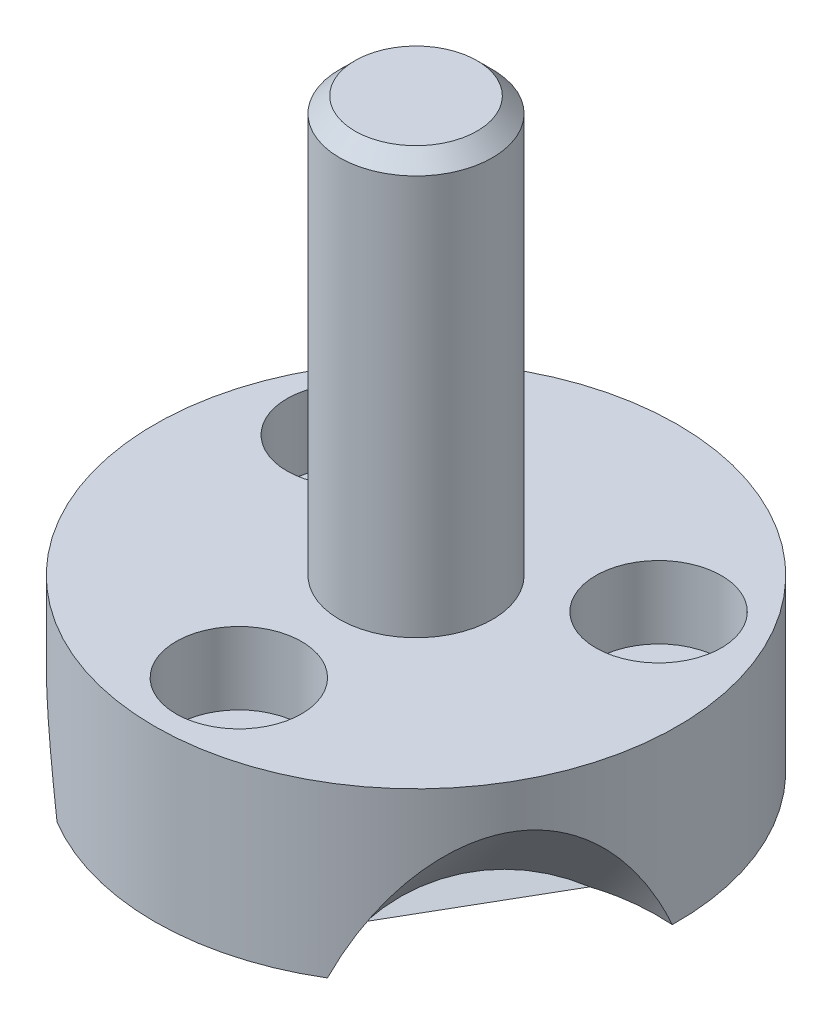
ISO-10303-21;
HEADER;
FILE_DESCRIPTION(('STEP AP214'),'2;1');
FILE_NAME('part.step','',(''),(''),'','','');
FILE_SCHEMA(('AUTOMOTIVE_DESIGN { 1 0 10303 214 1 1 1 1 }'));
ENDSEC;
DATA;
#1=APPLICATION_CONTEXT('core data for automotive mechanical design processes');
#2=APPLICATION_PROTOCOL_DEFINITION('international standard','automotive_design',2000,#1);
#3=PRODUCT_CONTEXT('',#1,'mechanical');
#4=PRODUCT('Part','Part','',(#3));
#5=PRODUCT_RELATED_PRODUCT_CATEGORY('part','',(#4));
#6=PRODUCT_DEFINITION_FORMATION('','',#4);
#7=PRODUCT_DEFINITION_CONTEXT('part definition',#1,'design');
#8=PRODUCT_DEFINITION('design','',#6,#7);
#9=PRODUCT_DEFINITION_SHAPE('','',#8);
#10=(LENGTH_UNIT() NAMED_UNIT(*) SI_UNIT(.MILLI.,.METRE.));
#11=(NAMED_UNIT(*) PLANE_ANGLE_UNIT() SI_UNIT($,.RADIAN.));
#12=(NAMED_UNIT(*) SI_UNIT($,.STERADIAN.) SOLID_ANGLE_UNIT());
#13=UNCERTAINTY_MEASURE_WITH_UNIT(LENGTH_MEASURE(1.E-05),#10,'distance_accuracy_value','');
#14=(GEOMETRIC_REPRESENTATION_CONTEXT(3) GLOBAL_UNCERTAINTY_ASSIGNED_CONTEXT((#13)) GLOBAL_UNIT_ASSIGNED_CONTEXT((#10,
#11,#12)) REPRESENTATION_CONTEXT('',''));
#15=CARTESIAN_POINT('',(0.,0.,0.));
#16=DIRECTION('',(0.,0.,1.));
#17=DIRECTION('',(1.,0.,0.));
#18=AXIS2_PLACEMENT_3D('',#15,#16,#17);
#19=CARTESIAN_POINT('',(0.,-5.5,0.));
#20=DIRECTION('',(0.,1.,0.));
#21=DIRECTION('',(0.,0.,1.));
#22=AXIS2_PLACEMENT_3D('',#19,#20,#21);
#23=CYLINDRICAL_SURFACE('',#22,8.5);
#24=CARTESIAN_POINT('',(0.,0.,0.));
#25=DIRECTION('',(0.,1.,0.));
#26=DIRECTION('',(0.,0.,1.));
#27=AXIS2_PLACEMENT_3D('',#24,#25,#26);
#28=CIRCLE('',#27,8.5);
#29=CARTESIAN_POINT('',(0.,0.,8.5));
#30=VERTEX_POINT('',#29);
#31=EDGE_CURVE('E104',#30,#30,#28,.T.);
#32=ORIENTED_EDGE('',*,*,#31,.F.);
#33=EDGE_LOOP('',(#32));
#34=FACE_BOUND('',#33,.T.);
#35=CARTESIAN_POINT('',(0.,-5.5,0.));
#36=DIRECTION('',(0.,1.,0.));
#37=DIRECTION('',(0.,0.,1.));
#38=AXIS2_PLACEMENT_3D('',#35,#36,#37);
#39=CIRCLE('',#38,8.5);
#40=CARTESIAN_POINT('',(-4.39532188587457,-5.5,7.27537940725788));
#41=VERTEX_POINT('',#40);
#42=CARTESIAN_POINT('',(4.39532188587467,-5.5,7.27537940725782));
#43=VERTEX_POINT('',#42);
#44=EDGE_CURVE('E103',#41,#43,#39,.T.);
#45=ORIENTED_EDGE('',*,*,#44,.T.);
#46=CARTESIAN_POINT('',(3.87157486946014,-7.13642907150665,7.56709376380157));
#47=CARTESIAN_POINT('',(3.91564223632895,-6.9681097408132,7.54454114760638));
#48=CARTESIAN_POINT('',(3.96249963914089,-6.80077804681708,7.52008784198153));
#49=CARTESIAN_POINT('',(4.06145164025423,-6.46830154059423,7.46711356025336));
#50=CARTESIAN_POINT('',(4.11354679466562,-6.3031569626922,7.43859215209081));
#51=CARTESIAN_POINT('',(4.2229635426209,-5.97427529652587,7.37702783136322));
#52=CARTESIAN_POINT('',(4.28031583151009,-5.81055350544804,7.34395771427627));
#53=CARTESIAN_POINT('',(4.39971674131166,-5.48587896915058,7.27305410577384));
#54=CARTESIAN_POINT('',(4.46176524198174,-5.32492615316323,7.23522073630071));
#55=CARTESIAN_POINT('',(4.59409760451867,-4.996944684743,7.15197384223668));
#56=CARTESIAN_POINT('',(4.66465021134646,-4.83010298261486,7.10624847353132));
#57=CARTESIAN_POINT('',(4.81066457433646,-4.5005524492161,7.0082267104109));
#58=CARTESIAN_POINT('',(4.88612590057415,-4.33784325773527,6.95593089108846));
#59=CARTESIAN_POINT('',(5.04169582267091,-4.01777041498957,6.84400953877659));
#60=CARTESIAN_POINT('',(5.12179228064553,-3.86039437346384,6.78440272955006));
#61=CARTESIAN_POINT('',(5.28674807347738,-3.55176294319107,6.65666447905091));
#62=CARTESIAN_POINT('',(5.37160535529237,-3.40050496380869,6.58853669698875));
#63=CARTESIAN_POINT('',(5.53394607118218,-3.12621598249609,6.45252156917746));
#64=CARTESIAN_POINT('',(5.61081220588198,-3.00218622106908,6.38592025444378));
#65=CARTESIAN_POINT('',(5.76807353882762,-2.76126537877963,6.24424044319747));
#66=CARTESIAN_POINT('',(5.84847011022187,-2.64437711860786,6.1691586300577));
#67=CARTESIAN_POINT('',(6.0116271689541,-2.42121358185558,6.01025409488309));
#68=CARTESIAN_POINT('',(6.09434763611927,-2.31482764312025,5.92654726230648));
#69=CARTESIAN_POINT('',(6.2626025587927,-2.1139985921488,5.74845945924758));
#70=CARTESIAN_POINT('',(6.34813348486487,-2.01954117167484,5.65409153929307));
#71=CARTESIAN_POINT('',(6.51937811079893,-1.84811963254262,5.45568584560505));
#72=CARTESIAN_POINT('',(6.60504665577054,-1.77081726957759,5.35190556025363));
#73=CARTESIAN_POINT('',(6.77699161126215,-1.63564576030467,5.13241853851379));
#74=CARTESIAN_POINT('',(6.86326805694279,-1.57777774764721,5.01671110690179));
#75=CARTESIAN_POINT('',(6.99159501431416,-1.50907243025117,4.83458646638067));
#76=CARTESIAN_POINT('',(7.03442578338447,-1.48912700191654,4.77207695088569));
#77=CARTESIAN_POINT('',(7.11916879807012,-1.45600651196527,4.644703838526));
#78=CARTESIAN_POINT('',(7.16108148968409,-1.44282808984782,4.57984142727889));
#79=CARTESIAN_POINT('',(7.24355179300335,-1.42365052608636,4.44825582658022));
#80=CARTESIAN_POINT('',(7.28411005080319,-1.41764791246247,4.38153355301899));
#81=CARTESIAN_POINT('',(7.36346475646622,-1.41298989370289,4.24682389569639));
#82=CARTESIAN_POINT('',(7.40226135263135,-1.41433386894887,4.17883661910858));
#83=CARTESIAN_POINT('',(7.50721543172153,-1.42829134617077,3.98885142508101));
#84=CARTESIAN_POINT('',(7.57110489715698,-1.44887896973935,3.86609755086801));
#85=CARTESIAN_POINT('',(7.69078052206784,-1.51136196051363,3.6222169176241));
#86=CARTESIAN_POINT('',(7.74656178037474,-1.55327014706342,3.50109118256495));
#87=CARTESIAN_POINT('',(7.86874874374449,-1.67367092478043,3.21934966265798));
#88=CARTESIAN_POINT('',(7.93156065501545,-1.75994152571497,3.06052249500513));
#89=CARTESIAN_POINT('',(8.04326353741963,-1.95708711608538,2.7536836226248));
#90=CARTESIAN_POINT('',(8.09212423708792,-2.06801469342191,2.60569594672328));
#91=CARTESIAN_POINT('',(8.17089781363809,-2.28690565792345,2.34554360793038));
#92=CARTESIAN_POINT('',(8.20262159274595,-2.39213912842785,2.23157762889415));
#93=CARTESIAN_POINT('',(8.25943621069332,-2.61191978592709,2.01114000399923));
#94=CARTESIAN_POINT('',(8.28452240891803,-2.72647341626476,1.90467363939893));
#95=CARTESIAN_POINT('',(8.32930184814948,-2.96349537283923,1.69822018628363));
#96=CARTESIAN_POINT('',(8.34896057595764,-3.08600849483582,1.59827751577239));
#97=CARTESIAN_POINT('',(8.38363007066104,-3.3367813127998,1.40512226971907));
#98=CARTESIAN_POINT('',(8.398641798056,-3.46503981495868,1.31190830646263));
#99=CARTESIAN_POINT('',(8.42537701279413,-3.73189150976843,1.12784709776155));
#100=CARTESIAN_POINT('',(8.43693014617856,-3.87069175274509,1.03727670548644));
#101=CARTESIAN_POINT('',(8.45658233013848,-4.15251963368135,0.862522288045537));
#102=CARTESIAN_POINT('',(8.46468056227391,-4.29554826474305,0.778339780000025));
#103=CARTESIAN_POINT('',(8.4780452408506,-4.58535287115684,0.615949418041944));
#104=CARTESIAN_POINT('',(8.48330749972258,-4.73213405459038,0.537750544785284));
#105=CARTESIAN_POINT('',(8.49150891100178,-5.02874985561887,0.38724017095559));
#106=CARTESIAN_POINT('',(8.49444794635255,-5.1785846266798,0.314928967199526));
#107=CARTESIAN_POINT('',(8.49839771934097,-5.4762278013474,0.178225102458596));
#108=CARTESIAN_POINT('',(8.49946548049044,-5.62395473678237,0.113656318736426));
#109=CARTESIAN_POINT('',(8.50021914948186,-5.92164714228945,-0.0101068724595229));
#110=CARTESIAN_POINT('',(8.49990503588927,-6.07161264704851,-0.0693011965544052));
#111=CARTESIAN_POINT('',(8.49823640742209,-6.37301039482655,-0.182070026597657));
#112=CARTESIAN_POINT('',(8.49688570374026,-6.52443526287883,-0.235664303741409));
#113=CARTESIAN_POINT('',(8.49345481098056,-6.8291067925773,-0.337335903687488));
#114=CARTESIAN_POINT('',(8.49137466840627,-6.98235333748541,-0.385413577927981));
#115=CARTESIAN_POINT('',(8.48908286700103,-7.13642907150665,-0.430664692295042));
#116=B_SPLINE_CURVE_WITH_KNOTS('',3,(#46,#47,#48,#49,#50,#51,#52,#53,#54,#55,#56,#57,#58,#59,
#60,#61,#62,#63,#64,#65,#66,#67,#68,#69,#70,#71,#72,#73,#74,#75,#76,#77,#78,#79,#80,#81,#82,#83,
#84,#85,#86,#87,#88,#89,#90,#91,#92,#93,#94,#95,#96,#97,#98,#99,#100,#101,#102,#103,#104,#105,
#106,#107,#108,#109,#110,#111,#112,#113,#114,#115),.UNSPECIFIED.,.F.,.F.,(4,2,2,2,2,2,2,2,2,2,2,
2,2,2,2,2,2,2,2,2,2,2,2,2,2,2,2,2,2,2,2,2,2,2,4),(0.,0.52630470390803,1.05266534651555,
1.58232323008113,2.11196755681693,2.67224290399541,3.23246924600453,3.79128966246386,
4.3498709201465,4.83071520074979,5.31174818954046,5.7870002618856,6.26167674328289,
6.72594203614381,7.19023440596687,7.4250215969606,7.65969207940853,7.89424897167399,
8.12878608149136,8.54630215976198,8.96406957375535,9.53487955527767,10.1069188334595,
10.5812513453392,11.0559146121617,11.5335301563574,12.0110469150276,12.5092222284578,
13.007515490422,13.5065425251256,14.0055947018824,14.4891560540191,14.972724906803,
15.4545243074039,15.9362929976529),.UNSPECIFIED.);
#117=CARTESIAN_POINT('',(8.49832433179278,-5.5,0.168770707348129));
#118=VERTEX_POINT('',#117);
#119=EDGE_CURVE('E91',#43,#118,#116,.T.);
#120=ORIENTED_EDGE('',*,*,#119,.T.);
#121=CARTESIAN_POINT('',(4.10300244591817,-5.5,-7.44415011460607));
#122=VERTEX_POINT('',#121);
#123=EDGE_CURVE('E96',#118,#122,#39,.T.);
#124=ORIENTED_EDGE('',*,*,#123,.T.);
#125=CARTESIAN_POINT('',(4.10300244591817,-5.5,-7.44415011460607));
#126=CARTESIAN_POINT('',(4.05200738124656,-5.36837939545004,-7.47225058635484));
#127=CARTESIAN_POINT('',(3.99885096925867,-5.23769581949763,-7.50087201404108));
#128=CARTESIAN_POINT('',(3.88795917211908,-4.97842335909559,-7.55894956009683));
#129=CARTESIAN_POINT('',(3.83022228553757,-4.84983517828135,-7.5884059501075));
#130=CARTESIAN_POINT('',(3.70942842946544,-4.59396369752363,-7.64818380408804));
#131=CARTESIAN_POINT('',(3.64632991259924,-4.46670118270769,-7.67851053446832));
#132=CARTESIAN_POINT('',(3.51492460300188,-4.21499725990791,-7.73954491256335));
#133=CARTESIAN_POINT('',(3.44661833250798,-4.09055557066906,-7.77025252182539));
#134=CARTESIAN_POINT('',(3.3026225115049,-3.84189383906078,-7.83255978348301));
#135=CARTESIAN_POINT('',(3.22679171223455,-3.71775607776666,-7.86416264767409));
#136=CARTESIAN_POINT('',(3.06871278474628,-3.47359206729499,-7.9271838158534));
#137=CARTESIAN_POINT('',(2.98646551640334,-3.35356527029627,-7.95860214396668));
#138=CARTESIAN_POINT('',(2.8152106932347,-3.11888996521952,-8.02077685643267));
#139=CARTESIAN_POINT('',(2.72622717782001,-3.00422449389544,-8.05153513453971));
#140=CARTESIAN_POINT('',(2.54057268772807,-2.78105841424943,-8.1120294221836));
#141=CARTESIAN_POINT('',(2.44390609063601,-2.67255435491657,-8.14176600021434));
#142=CARTESIAN_POINT('',(2.28250107599027,-2.5051943175923,-8.188048798338));
#143=CARTESIAN_POINT('',(2.22047894796706,-2.4438568700838,-8.20510842756374));
#144=CARTESIAN_POINT('',(2.09320540606682,-2.32440813328902,-8.23849602234772));
#145=CARTESIAN_POINT('',(2.0279536443655,-2.26629719292656,-8.2548239087365));
#146=CARTESIAN_POINT('',(1.82743265284243,-2.09783429025509,-8.30237166731931));
#147=CARTESIAN_POINT('',(1.6870747850213,-1.99301034158126,-8.33225056053869));
#148=CARTESIAN_POINT('',(1.39001427743714,-1.80238910383917,-8.38694571169093));
#149=CARTESIAN_POINT('',(1.23312405190653,-1.71685486498451,-8.41169164584652));
#150=CARTESIAN_POINT('',(0.987926390141024,-1.60980966570019,-8.44279508895132));
#151=CARTESIAN_POINT('',(0.904589457200721,-1.57768021842646,-8.45215749198613));
#152=CARTESIAN_POINT('',(0.735062615100133,-1.52140191443346,-8.46858543137649));
#153=CARTESIAN_POINT('',(0.648873764324658,-1.49725013284282,-8.47565180951379));
#154=CARTESIAN_POINT('',(0.427951099860851,-1.4473350373683,-8.49027121159061));
#155=CARTESIAN_POINT('',(0.291689551723714,-1.42749660558052,-8.49609874236993));
#156=CARTESIAN_POINT('',(0.0176849746978008,-1.41051535160195,-8.50108594812936));
#157=CARTESIAN_POINT('',(-0.120057524937583,-1.4133646740909,-8.50024793096311));
#158=CARTESIAN_POINT('',(-0.392743304210189,-1.44140511570736,-8.49201605382392));
#159=CARTESIAN_POINT('',(-0.527691288564347,-1.46655491634786,-8.48463431810659));
#160=CARTESIAN_POINT('',(-0.791782459923716,-1.5368043713075,-8.46408212648829));
#161=CARTESIAN_POINT('',(-0.920921290626464,-1.58191873115134,-8.45090740362603));
#162=CARTESIAN_POINT('',(-1.2264928262482,-1.71228515141529,-8.4130093836411));
#163=CARTESIAN_POINT('',(-1.39877692995277,-1.80646335462337,-8.38575531626123));
#164=CARTESIAN_POINT('',(-1.72588648253423,-2.01970653475278,-8.3246151014175));
#165=CARTESIAN_POINT('',(-1.88066516351825,-2.13883586072945,-8.29071182027117));
#166=CARTESIAN_POINT('',(-2.15090154066114,-2.37471692645606,-8.22434294734774));
#167=CARTESIAN_POINT('',(-2.2687341086961,-2.48896984335108,-8.19247042295787));
#168=CARTESIAN_POINT('',(-2.49380875424836,-2.72704745586128,-8.1267876947958));
#169=CARTESIAN_POINT('',(-2.60104267644778,-2.85087939361705,-8.09297603004637));
#170=CARTESIAN_POINT('',(-2.80632154609719,-3.10634632326903,-8.02410845425059));
#171=CARTESIAN_POINT('',(-2.90433045786907,-3.23800888271861,-7.98904834591457));
#172=CARTESIAN_POINT('',(-3.0916810506407,-3.50713945302687,-7.91842932956664));
#173=CARTESIAN_POINT('',(-3.18102520917198,-3.64460578816744,-7.88287056748415));
#174=CARTESIAN_POINT('',(-3.3499548364079,-3.92107021483571,-7.81255247020373));
#175=CARTESIAN_POINT('',(-3.42971701182835,-4.05996102199552,-7.77779348804984));
#176=CARTESIAN_POINT('',(-3.58243704550269,-4.34153769433779,-7.70864236692192));
#177=CARTESIAN_POINT('',(-3.65539391835626,-4.48422410528711,-7.67425028171073));
#178=CARTESIAN_POINT('',(-3.79409067796556,-4.77093208283211,-7.60662600360306));
#179=CARTESIAN_POINT('',(-3.85991200391708,-4.91491222760835,-7.57338454696442));
#180=CARTESIAN_POINT('',(-3.98572736651346,-5.20553762483576,-7.50792650062966));
#181=CARTESIAN_POINT('',(-4.04572435261965,-5.35218148323759,-7.47570939781554));
#182=CARTESIAN_POINT('',(-4.10300244591817,-5.5,-7.44415011460607));
#183=B_SPLINE_CURVE_WITH_KNOTS('',3,(#125,#126,#127,#128,#129,#130,#131,#132,#133,#134,#135,
#136,#137,#138,#139,#140,#141,#142,#143,#144,#145,#146,#147,#148,#149,#150,#151,#152,#153,#154,
#155,#156,#157,#158,#159,#160,#161,#162,#163,#164,#165,#166,#167,#168,#169,#170,#171,#172,#173,
#174,#175,#176,#177,#178,#179,#180,#181,#182),.UNSPECIFIED.,.F.,.F.,(4,2,2,2,2,2,2,2,2,2,2,2,2,
2,2,2,2,2,2,2,2,2,2,2,2,2,2,2,4),(0.,0.43176735396568,0.86367682603263,1.2993071972587,
1.73489394047465,2.18130009103921,2.62764652086448,3.07246905274674,3.51703993062881,
3.78357796441595,4.05014476647939,4.58184689295916,5.12041195392308,5.38945473963858,
5.65839877576043,6.06982437872431,6.48110753747512,6.89163025641231,7.30245586340119,
7.89377583898554,8.48664003540864,8.98751996153729,9.48878234622662,9.99192792795134,
10.494929217375,10.9864041693644,11.4779501762714,11.9631108808027,12.4480246028145),.UNSPECIFIED.);
#184=CARTESIAN_POINT('',(-4.10300244591817,-5.5,-7.44415011460607));
#185=VERTEX_POINT('',#184);
#186=EDGE_CURVE('E152',#122,#185,#183,.T.);
#187=ORIENTED_EDGE('',*,*,#186,.T.);
#188=CARTESIAN_POINT('',(-8.49832433179278,-5.5,0.168770707348247));
#189=VERTEX_POINT('',#188);
#190=EDGE_CURVE('E106',#185,#189,#39,.T.);
#191=ORIENTED_EDGE('',*,*,#190,.T.);
#192=CARTESIAN_POINT('',(-8.49832433179278,-5.5,0.168770707348248));
#193=CARTESIAN_POINT('',(-8.49716252184974,-5.36837939545004,0.226983964695883));
#194=CARTESIAN_POINT('',(-8.49537119932465,-5.23769581949763,0.287329481694546));
#195=CARTESIAN_POINT('',(-8.4902219310286,-4.97842335909559,0.412403368116617));
#196=CARTESIAN_POINT('',(-8.48686346979087,-4.84983517828135,0.477133173636961));
#197=CARTESIAN_POINT('',(-8.47823568188567,-4.59396369752363,0.611632648606781));
#198=CARTESIAN_POINT('',(-8.47295014237561,-4.46670118270769,0.681440932344171));
#199=CARTESIAN_POINT('',(-8.46010480951141,-4.21499725990791,0.825758457695156));
#200=CARTESIAN_POINT('',(-8.45254524397487,-4.09055557066906,0.900267227811663));
#201=CARTESIAN_POINT('',(-8.43450700490907,-3.84189383906077,1.05612489766794));
#202=CARTESIAN_POINT('',(-8.42396048849572,-3.71775607776666,1.13759772832089));
#203=CARTESIAN_POINT('',(-8.39949895737104,-3.47359206729499,1.30600867941837));
#204=CARTESIAN_POINT('',(-8.38558439349011,-3.35356527029627,1.39294606725187));
#205=CARTESIAN_POINT('',(-8.35380186237432,-3.11888996521951,1.57234445086952));
#206=CARTESIAN_POINT('',(-8.33594755488434,-3.00422449389543,1.66478557479021));
#207=CARTESIAN_POINT('',(-8.29550989972182,-2.78105841424943,1.85581422335842));
#208=CARTESIAN_POINT('',(-8.27292923317204,-2.67255435491657,1.95439824115291));
#209=CARTESIAN_POINT('',(-8.23230880478248,-2.5051943175923,2.11732048319615));
#210=CARTESIAN_POINT('',(-8.21607181305951,-2.4438568700838,2.17956303627389));
#211=CARTESIAN_POINT('',(-8.18134954736358,-2.32440813328902,2.30647895418111));
#212=CARTESIAN_POINT('',(-8.1628640309157,-2.26629719292656,2.37115258065054));
#213=CARTESIAN_POINT('',(-8.10378110197989,-2.09783429025509,2.56858273259296));
#214=CARTESIAN_POINT('',(-8.05947804863427,-1.99301034158126,2.70507565835677));
#215=CARTESIAN_POINT('',(-7.95831518520386,-1.80238910383917,2.98968517996187));
#216=CARTESIAN_POINT('',(-7.90130068005768,-1.71685486498451,3.13792906795464));
#217=CARTESIAN_POINT('',(-7.80563822104884,-1.60980966570019,3.36582819354452));
#218=CARTESIAN_POINT('',(-7.7720778334473,-1.57768021842647,3.4426812960617));
#219=CARTESIAN_POINT('',(-7.70154142524088,-1.52140191443346,3.59770981763934));
#220=CARTESIAN_POINT('',(-7.6645666628328,-1.49725013284282,3.67588474100254));
#221=CARTESIAN_POINT('',(-7.56676610418756,-1.4473350373683,3.87451908173836));
#222=CARTESIAN_POINT('',(-7.50368211981522,-1.42749660558052,3.99543880937377));
#223=CARTESIAN_POINT('',(-7.37099887818383,-1.41051535160195,4.23522733671114));
#224=CARTESIAN_POINT('',(-7.30140188421136,-1.4133646740909,4.35409683199302));
#225=CARTESIAN_POINT('',(-7.15792997985168,-1.44140511570736,4.58613370552426));
#226=CARTESIAN_POINT('',(-7.08406321701937,-1.46655491634786,4.6993112203058));
#227=CARTESIAN_POINT('',(-6.93421891129479,-1.5368043713075,4.91774478780905));
#228=CARTESIAN_POINT('',(-6.85823985125687,-1.58191873115134,5.02299493438151));
#229=CARTESIAN_POINT('',(-6.67263343538593,-1.71228515141529,5.2686786369109));
#230=CARTESIAN_POINT('',(-6.56288866882622,-1.80646335462337,5.40425401369735));
#231=CARTESIAN_POINT('',(-6.34638491328799,-2.01970653475279,5.65696908863159));
#232=CARTESIAN_POINT('',(-6.23963447005161,-2.13883586072945,5.77405971775483));
#233=CARTESIAN_POINT('',(-6.04703915150793,-2.37471692645606,5.97490684892553));
#234=CARTESIAN_POINT('',(-5.96052045168608,-2.48896984335108,6.06101658404203));
#235=CARTESIAN_POINT('',(-5.79110021773173,-2.72704745586128,6.22309558075703));
#236=CARTESIAN_POINT('',(-5.70820149601477,-2.85087939361705,6.29905704915446));
#237=CARTESIAN_POINT('',(-5.54592099105387,-3.10634632326903,6.44239997723311));
#238=CARTESIAN_POINT('',(-5.4665535906895,-3.23800888271861,6.50974813045682));
#239=CARTESIAN_POINT('',(-5.31172043215611,-3.50713945302687,6.63668899503716));
#240=CARTESIAN_POINT('',(-5.2362535615999,-3.64460578816744,6.69628392496374));
#241=CARTESIAN_POINT('',(-5.09089148939132,-3.92107021483571,6.80742222496167));
#242=CARTESIAN_POINT('',(-5.02090824012613,-4.05996102199552,6.85911880405994));
#243=CARTESIAN_POINT('',(-4.88466159569201,-4.34153769433779,6.95680267232478));
#244=CARTESIAN_POINT('',(-4.81839873978322,-4.48422410528711,7.00278913499105));
#245=CARTESIAN_POINT('',(-4.69048601722474,-4.77093208283211,7.08909191318146));
#246=CARTESIAN_POINT('',(-4.62878740834112,-4.91491222760835,7.12947412524692));
#247=CARTESIAN_POINT('',(-4.50919139603493,-5.20553762483576,7.20570440227436));
#248=CARTESIAN_POINT('',(-4.45129207350846,-5.35218148323759,7.24155476498576));
#249=CARTESIAN_POINT('',(-4.39532188587457,-5.5,7.27537940725788));
#250=B_SPLINE_CURVE_WITH_KNOTS('',3,(#192,#193,#194,#195,#196,#197,#198,#199,#200,#201,#202,
#203,#204,#205,#206,#207,#208,#209,#210,#211,#212,#213,#214,#215,#216,#217,#218,#219,#220,#221,
#222,#223,#224,#225,#226,#227,#228,#229,#230,#231,#232,#233,#234,#235,#236,#237,#238,#239,#240,
#241,#242,#243,#244,#245,#246,#247,#248,#249),.UNSPECIFIED.,.F.,.F.,(4,2,2,2,2,2,2,2,2,2,2,2,2,
2,2,2,2,2,2,2,2,2,2,2,2,2,2,2,4),(0.,0.431767353965681,0.86367682603263,1.2993071972587,
1.73489394047465,2.18130009103921,2.62764652086448,3.07246905274674,3.51703993062881,
3.78357796441595,4.05014476647939,4.58184689295917,5.12041195392308,5.38945473963858,
5.65839877576043,6.06982437872431,6.48110753747512,6.89163025641231,7.30245586340118,
7.89377583898554,8.48664003540864,8.98751996153729,9.48878234622661,9.99192792795134,
10.494929217375,10.9864041693643,11.4779501762714,11.9631108808027,12.4480246028145),.UNSPECIFIED.);
#251=EDGE_CURVE('E148',#189,#41,#250,.T.);
#252=ORIENTED_EDGE('',*,*,#251,.T.);
#253=EDGE_LOOP('',(#45,#120,#124,#187,#191,#252));
#254=FACE_BOUND('',#253,.T.);
#255=ADVANCED_FACE('F32',(#34,#254),#23,.T.);
#256=CARTESIAN_POINT('',(0.,-5.5,0.));
#257=DIRECTION('',(0.,1.,0.));
#258=DIRECTION('',(0.,0.,1.));
#259=AXIS2_PLACEMENT_3D('',#256,#257,#258);
#260=PLANE('',#259);
#261=CARTESIAN_POINT('',(0.,-5.5,0.));
#262=DIRECTION('',(0.,-1.,0.));
#263=DIRECTION('',(0.,0.,-1.));
#264=AXIS2_PLACEMENT_3D('',#261,#262,#263);
#265=CIRCLE('',#264,4.5);
#266=CARTESIAN_POINT('',(0.,-5.5,-4.5));
#267=VERTEX_POINT('',#266);
#268=EDGE_CURVE('E209',#267,#267,#265,.T.);
#269=ORIENTED_EDGE('',*,*,#268,.F.);
#270=EDGE_LOOP('',(#269));
#271=FACE_BOUND('',#270,.T.);
#272=CARTESIAN_POINT('',(4.96598786707596,-5.5,-2.91930210051211));
#273=DIRECTION('',(0.,1.,0.));
#274=DIRECTION('',(0.,0.,1.));
#275=AXIS2_PLACEMENT_3D('',#272,#273,#274);
#276=CIRCLE('',#275,1.065);
#277=CARTESIAN_POINT('',(4.96598786707596,-5.5,-1.85430210051211));
#278=VERTEX_POINT('',#277);
#279=EDGE_CURVE('E129',#278,#278,#276,.T.);
#280=ORIENTED_EDGE('',*,*,#279,.T.);
#281=EDGE_LOOP('',(#280));
#282=FACE_BOUND('',#281,.T.);
#283=CARTESIAN_POINT('',(0.,-5.5,5.7605));
#284=DIRECTION('',(0.,1.,0.));
#285=DIRECTION('',(0.,0.,1.));
#286=AXIS2_PLACEMENT_3D('',#283,#284,#285);
#287=CIRCLE('',#286,1.065);
#288=CARTESIAN_POINT('',(0.,-5.5,6.8255));
#289=VERTEX_POINT('',#288);
#290=EDGE_CURVE('E187',#289,#289,#287,.T.);
#291=ORIENTED_EDGE('',*,*,#290,.T.);
#292=EDGE_LOOP('',(#291));
#293=FACE_BOUND('',#292,.T.);
#294=CARTESIAN_POINT('',(-5.03393518532704,-5.5,-2.88007269802913));
#295=DIRECTION('',(0.,1.,0.));
#296=DIRECTION('',(0.,0.,1.));
#297=AXIS2_PLACEMENT_3D('',#294,#295,#296);
#298=CIRCLE('',#297,1.065);
#299=CARTESIAN_POINT('',(-5.03393518532704,-5.5,-1.81507269802913));
#300=VERTEX_POINT('',#299);
#301=EDGE_CURVE('E134',#300,#300,#298,.T.);
#302=ORIENTED_EDGE('',*,*,#301,.T.);
#303=EDGE_LOOP('',(#302));
#304=FACE_BOUND('',#303,.T.);
#305=CARTESIAN_POINT('',(9.9465454397029,-5.5,5.74264068711919));
#306=DIRECTION('',(0.,1.,0.));
#307=DIRECTION('',(-0.866025403784443,0.,-0.499999999999992));
#308=AXIS2_PLACEMENT_3D('',#305,#306,#307);
#309=ELLIPSE('',#308,7.07106781186548,5.);
#310=CARTESIAN_POINT('',(6.0943237272159,-5.5,0.444321666689478));
#311=VERTEX_POINT('',#310);
#312=EDGE_CURVE('E11',#311,#118,#309,.F.);
#313=ORIENTED_EDGE('',*,*,#312,.F.);
#314=DIRECTION('',(0.499999999999992,0.,-0.866025403784443));
#315=VECTOR('',#314,1.);
#316=CARTESIAN_POINT('',(4.76313972081444,-5.5,2.74999999999995));
#317=LINE('',#316,#315);
#318=CARTESIAN_POINT('',(3.43195571441297,-5.5,5.05567833331043));
#319=VERTEX_POINT('',#318);
#320=EDGE_CURVE('E82',#319,#311,#317,.T.);
#321=ORIENTED_EDGE('',*,*,#320,.F.);
#322=EDGE_CURVE('E36',#43,#319,#309,.F.);
#323=ORIENTED_EDGE('',*,*,#322,.F.);
#324=ORIENTED_EDGE('',*,*,#44,.F.);
#325=CARTESIAN_POINT('',(-9.94654543970282,-5.5,5.74264068711933));
#326=DIRECTION('',(0.,1.,0.));
#327=DIRECTION('',(0.866025403784436,0.,-0.500000000000004));
#328=AXIS2_PLACEMENT_3D('',#325,#326,#327);
#329=ELLIPSE('',#328,7.07106781186548,5.);
#330=CARTESIAN_POINT('',(-3.4319557144129,-5.5,5.05567833331048));
#331=VERTEX_POINT('',#330);
#332=EDGE_CURVE('E87',#331,#41,#329,.F.);
#333=ORIENTED_EDGE('',*,*,#332,.F.);
#334=DIRECTION('',(0.500000000000004,0.,0.866025403784436));
#335=VECTOR('',#334,1.);
#336=CARTESIAN_POINT('',(-4.7631397208144,-5.5,2.75000000000002));
#337=LINE('',#336,#335);
#338=CARTESIAN_POINT('',(-6.09432372721589,-5.5,0.444321666689563));
#339=VERTEX_POINT('',#338);
#340=EDGE_CURVE('E140',#339,#331,#337,.T.);
#341=ORIENTED_EDGE('',*,*,#340,.F.);
#342=EDGE_CURVE('E142',#189,#339,#329,.F.);
#343=ORIENTED_EDGE('',*,*,#342,.F.);
#344=ORIENTED_EDGE('',*,*,#190,.F.);
#345=CARTESIAN_POINT('',(0.,-5.5,-11.4852813742386));
#346=DIRECTION('',(0.,1.,0.));
#347=DIRECTION('',(0.,0.,1.));
#348=AXIS2_PLACEMENT_3D('',#345,#346,#347);
#349=ELLIPSE('',#348,7.07106781186548,5.);
#350=CARTESIAN_POINT('',(-2.66236801280297,-5.5,-5.5));
#351=VERTEX_POINT('',#350);
#352=EDGE_CURVE('E139',#351,#185,#349,.F.);
#353=ORIENTED_EDGE('',*,*,#352,.F.);
#354=DIRECTION('',(-1.,0.,0.));
#355=VECTOR('',#354,1.);
#356=CARTESIAN_POINT('',(0.,-5.5,-5.5));
#357=LINE('',#356,#355);
#358=CARTESIAN_POINT('',(2.66236801280297,-5.5,-5.5));
#359=VERTEX_POINT('',#358);
#360=EDGE_CURVE('E122',#359,#351,#357,.T.);
#361=ORIENTED_EDGE('',*,*,#360,.F.);
#362=EDGE_CURVE('E99',#122,#359,#349,.F.);
#363=ORIENTED_EDGE('',*,*,#362,.F.);
#364=ORIENTED_EDGE('',*,*,#123,.F.);
#365=EDGE_LOOP('',(#313,#321,#323,#324,#333,#341,#343,#344,#353,#361,#363,#364));
#366=FACE_BOUND('',#365,.T.);
#367=ADVANCED_FACE('F94',(#271,#282,#293,#304,#366),#260,.F.);
#368=CARTESIAN_POINT('',(0.,0.,0.));
#369=DIRECTION('',(0.,1.,0.));
#370=DIRECTION('',(0.,0.,1.));
#371=AXIS2_PLACEMENT_3D('',#368,#369,#370);
#372=PLANE('',#371);
#373=CARTESIAN_POINT('',(-5.03393518532704,0.,-2.88007269802913));
#374=DIRECTION('',(0.,1.,0.));
#375=DIRECTION('',(0.,0.,1.));
#376=AXIS2_PLACEMENT_3D('',#373,#374,#375);
#377=CIRCLE('',#376,2.04);
#378=CARTESIAN_POINT('',(-5.03393518532704,0.,-0.840072698029131));
#379=VERTEX_POINT('',#378);
#380=EDGE_CURVE('E198',#379,#379,#377,.T.);
#381=ORIENTED_EDGE('',*,*,#380,.F.);
#382=EDGE_LOOP('',(#381));
#383=FACE_BOUND('',#382,.T.);
#384=CARTESIAN_POINT('',(4.96598786707596,0.,-2.91930210051211));
#385=DIRECTION('',(0.,1.,0.));
#386=DIRECTION('',(0.,0.,1.));
#387=AXIS2_PLACEMENT_3D('',#384,#385,#386);
#388=CIRCLE('',#387,2.04);
#389=CARTESIAN_POINT('',(4.96598786707596,0.,-0.879302100512111));
#390=VERTEX_POINT('',#389);
#391=EDGE_CURVE('E128',#390,#390,#388,.T.);
#392=ORIENTED_EDGE('',*,*,#391,.F.);
#393=EDGE_LOOP('',(#392));
#394=FACE_BOUND('',#393,.T.);
#395=CARTESIAN_POINT('',(0.,0.,5.7605));
#396=DIRECTION('',(0.,1.,0.));
#397=DIRECTION('',(0.,0.,1.));
#398=AXIS2_PLACEMENT_3D('',#395,#396,#397);
#399=CIRCLE('',#398,2.04);
#400=CARTESIAN_POINT('',(0.,0.,7.8005));
#401=VERTEX_POINT('',#400);
#402=EDGE_CURVE('E197',#401,#401,#399,.T.);
#403=ORIENTED_EDGE('',*,*,#402,.F.);
#404=EDGE_LOOP('',(#403));
#405=FACE_BOUND('',#404,.T.);
#406=CARTESIAN_POINT('',(0.,0.,0.));
#407=DIRECTION('',(0.,1.,0.));
#408=DIRECTION('',(0.,0.,1.));
#409=AXIS2_PLACEMENT_3D('',#406,#407,#408);
#410=CIRCLE('',#409,2.485);
#411=CARTESIAN_POINT('',(0.,0.,2.485));
#412=VERTEX_POINT('',#411);
#413=EDGE_CURVE('E109',#412,#412,#410,.T.);
#414=ORIENTED_EDGE('',*,*,#413,.F.);
#415=EDGE_LOOP('',(#414));
#416=FACE_BOUND('',#415,.T.);
#417=ORIENTED_EDGE('',*,*,#31,.T.);
#418=EDGE_LOOP('',(#417));
#419=FACE_BOUND('',#418,.T.);
#420=ADVANCED_FACE('F221',(#383,#394,#405,#416,#419),#372,.T.);
#421=CARTESIAN_POINT('',(0.,13.5,0.));
#422=DIRECTION('',(0.,-1.,0.));
#423=DIRECTION('',(0.,0.,-1.));
#424=AXIS2_PLACEMENT_3D('',#421,#422,#423);
#425=CYLINDRICAL_SURFACE('',#424,2.485);
#426=CARTESIAN_POINT('',(0.,13.,0.));
#427=DIRECTION('',(0.,1.,0.));
#428=DIRECTION('',(0.,0.,1.));
#429=AXIS2_PLACEMENT_3D('',#426,#427,#428);
#430=CIRCLE('',#429,2.485);
#431=CARTESIAN_POINT('',(0.,13.,2.485));
#432=VERTEX_POINT('',#431);
#433=EDGE_CURVE('E117',#432,#432,#430,.F.);
#434=ORIENTED_EDGE('',*,*,#433,.T.);
#435=EDGE_LOOP('',(#434));
#436=FACE_BOUND('',#435,.T.);
#437=ORIENTED_EDGE('',*,*,#413,.T.);
#438=EDGE_LOOP('',(#437));
#439=FACE_BOUND('',#438,.T.);
#440=ADVANCED_FACE('F219',(#436,#439),#425,.T.);
#441=CARTESIAN_POINT('',(0.,13.5,0.));
#442=DIRECTION('',(0.,1.,0.));
#443=DIRECTION('',(0.,0.,1.));
#444=AXIS2_PLACEMENT_3D('',#441,#442,#443);
#445=PLANE('',#444);
#446=CARTESIAN_POINT('',(0.,13.5,0.));
#447=DIRECTION('',(0.,1.,0.));
#448=DIRECTION('',(0.,0.,1.));
#449=AXIS2_PLACEMENT_3D('',#446,#447,#448);
#450=CIRCLE('',#449,1.98499999999999);
#451=CARTESIAN_POINT('',(0.,13.5,1.98499999999999));
#452=VERTEX_POINT('',#451);
#453=EDGE_CURVE('E113',#452,#452,#450,.T.);
#454=ORIENTED_EDGE('',*,*,#453,.T.);
#455=EDGE_LOOP('',(#454));
#456=FACE_BOUND('',#455,.T.);
#457=ADVANCED_FACE('F240',(#456),#445,.T.);
#458=CARTESIAN_POINT('',(0.,-2.96,0.));
#459=DIRECTION('',(0.,-1.,0.));
#460=DIRECTION('',(0.,0.,-1.));
#461=AXIS2_PLACEMENT_3D('',#458,#459,#460);
#462=CYLINDRICAL_SURFACE('',#461,4.5);
#463=CARTESIAN_POINT('',(0.,-2.96,0.));
#464=DIRECTION('',(0.,-1.,0.));
#465=DIRECTION('',(0.,0.,-1.));
#466=AXIS2_PLACEMENT_3D('',#463,#464,#465);
#467=CIRCLE('',#466,4.5);
#468=CARTESIAN_POINT('',(0.,-2.96,-4.5));
#469=VERTEX_POINT('',#468);
#470=EDGE_CURVE('E212',#469,#469,#467,.T.);
#471=ORIENTED_EDGE('',*,*,#470,.F.);
#472=EDGE_LOOP('',(#471));
#473=FACE_BOUND('',#472,.T.);
#474=ORIENTED_EDGE('',*,*,#268,.T.);
#475=EDGE_LOOP('',(#474));
#476=FACE_BOUND('',#475,.T.);
#477=ADVANCED_FACE('F244',(#473,#476),#462,.F.);
#478=CARTESIAN_POINT('',(0.,-2.96,0.));
#479=DIRECTION('',(0.,-1.,0.));
#480=DIRECTION('',(0.,0.,-1.));
#481=AXIS2_PLACEMENT_3D('',#478,#479,#480);
#482=PLANE('',#481);
#483=ORIENTED_EDGE('',*,*,#470,.T.);
#484=EDGE_LOOP('',(#483));
#485=FACE_BOUND('',#484,.T.);
#486=ADVANCED_FACE('F247',(#485),#482,.T.);
#487=CARTESIAN_POINT('',(0.,13.5,0.));
#488=DIRECTION('',(0.,-1.,0.));
#489=DIRECTION('',(0.,0.,-1.));
#490=AXIS2_PLACEMENT_3D('',#487,#488,#489);
#491=CONICAL_SURFACE('',#490,1.98499999999999,0.785398163397447);
#492=ORIENTED_EDGE('',*,*,#433,.F.);
#493=EDGE_LOOP('',(#492));
#494=FACE_BOUND('',#493,.T.);
#495=ORIENTED_EDGE('',*,*,#453,.F.);
#496=EDGE_LOOP('',(#495));
#497=FACE_BOUND('',#496,.T.);
#498=ADVANCED_FACE('F34',(#494,#497),#491,.T.);
#499=CARTESIAN_POINT('',(0.,-2.35,5.7605));
#500=DIRECTION('',(0.,1.,0.));
#501=DIRECTION('',(0.,0.,1.));
#502=AXIS2_PLACEMENT_3D('',#499,#500,#501);
#503=CYLINDRICAL_SURFACE('',#502,2.04);
#504=CARTESIAN_POINT('',(0.,-2.35,5.7605));
#505=DIRECTION('',(0.,1.,0.));
#506=DIRECTION('',(0.,0.,1.));
#507=AXIS2_PLACEMENT_3D('',#504,#505,#506);
#508=CIRCLE('',#507,2.04);
#509=CARTESIAN_POINT('',(0.,-2.35,7.8005));
#510=VERTEX_POINT('',#509);
#511=EDGE_CURVE('E206',#510,#510,#508,.T.);
#512=ORIENTED_EDGE('',*,*,#511,.F.);
#513=EDGE_LOOP('',(#512));
#514=FACE_BOUND('',#513,.T.);
#515=ORIENTED_EDGE('',*,*,#402,.T.);
#516=EDGE_LOOP('',(#515));
#517=FACE_BOUND('',#516,.T.);
#518=ADVANCED_FACE('F252',(#514,#517),#503,.F.);
#519=CARTESIAN_POINT('',(0.,-2.35,5.7605));
#520=DIRECTION('',(0.,1.,0.));
#521=DIRECTION('',(0.,0.,1.));
#522=AXIS2_PLACEMENT_3D('',#519,#520,#521);
#523=PLANE('',#522);
#524=CARTESIAN_POINT('',(0.,-2.35,5.7605));
#525=DIRECTION('',(0.,1.,0.));
#526=DIRECTION('',(0.,0.,1.));
#527=AXIS2_PLACEMENT_3D('',#524,#525,#526);
#528=CIRCLE('',#527,1.065);
#529=CARTESIAN_POINT('',(0.,-2.35,6.8255));
#530=VERTEX_POINT('',#529);
#531=EDGE_CURVE('E133',#530,#530,#528,.T.);
#532=ORIENTED_EDGE('',*,*,#531,.F.);
#533=EDGE_LOOP('',(#532));
#534=FACE_BOUND('',#533,.T.);
#535=ORIENTED_EDGE('',*,*,#511,.T.);
#536=EDGE_LOOP('',(#535));
#537=FACE_BOUND('',#536,.T.);
#538=ADVANCED_FACE('F255',(#534,#537),#523,.T.);
#539=CARTESIAN_POINT('',(4.96598786707596,-2.35,-2.91930210051211));
#540=DIRECTION('',(0.,1.,0.));
#541=DIRECTION('',(0.,0.,1.));
#542=AXIS2_PLACEMENT_3D('',#539,#540,#541);
#543=CYLINDRICAL_SURFACE('',#542,2.04);
#544=CARTESIAN_POINT('',(4.96598786707596,-2.35,-2.91930210051211));
#545=DIRECTION('',(0.,1.,0.));
#546=DIRECTION('',(0.,0.,1.));
#547=AXIS2_PLACEMENT_3D('',#544,#545,#546);
#548=CIRCLE('',#547,2.04);
#549=CARTESIAN_POINT('',(4.96598786707596,-2.35,-0.879302100512111));
#550=VERTEX_POINT('',#549);
#551=EDGE_CURVE('E201',#550,#550,#548,.T.);
#552=ORIENTED_EDGE('',*,*,#551,.F.);
#553=EDGE_LOOP('',(#552));
#554=FACE_BOUND('',#553,.T.);
#555=ORIENTED_EDGE('',*,*,#391,.T.);
#556=EDGE_LOOP('',(#555));
#557=FACE_BOUND('',#556,.T.);
#558=ADVANCED_FACE('F259',(#554,#557),#543,.F.);
#559=CARTESIAN_POINT('',(4.96598786707596,-2.35,-2.91930210051211));
#560=DIRECTION('',(0.,1.,0.));
#561=DIRECTION('',(0.,0.,1.));
#562=AXIS2_PLACEMENT_3D('',#559,#560,#561);
#563=PLANE('',#562);
#564=CARTESIAN_POINT('',(4.96598786707596,-2.35,-2.91930210051211));
#565=DIRECTION('',(0.,1.,0.));
#566=DIRECTION('',(0.,0.,1.));
#567=AXIS2_PLACEMENT_3D('',#564,#565,#566);
#568=CIRCLE('',#567,1.065);
#569=CARTESIAN_POINT('',(4.96598786707596,-2.35,-1.85430210051211));
#570=VERTEX_POINT('',#569);
#571=EDGE_CURVE('E125',#570,#570,#568,.T.);
#572=ORIENTED_EDGE('',*,*,#571,.F.);
#573=EDGE_LOOP('',(#572));
#574=FACE_BOUND('',#573,.T.);
#575=ORIENTED_EDGE('',*,*,#551,.T.);
#576=EDGE_LOOP('',(#575));
#577=FACE_BOUND('',#576,.T.);
#578=ADVANCED_FACE('F263',(#574,#577),#563,.T.);
#579=CARTESIAN_POINT('',(-5.03393518532704,-2.35,-2.88007269802913));
#580=DIRECTION('',(0.,1.,0.));
#581=DIRECTION('',(0.,0.,1.));
#582=AXIS2_PLACEMENT_3D('',#579,#580,#581);
#583=CYLINDRICAL_SURFACE('',#582,2.04);
#584=CARTESIAN_POINT('',(-5.03393518532704,-2.35,-2.88007269802913));
#585=DIRECTION('',(0.,1.,0.));
#586=DIRECTION('',(0.,0.,1.));
#587=AXIS2_PLACEMENT_3D('',#584,#585,#586);
#588=CIRCLE('',#587,2.04);
#589=CARTESIAN_POINT('',(-5.03393518532704,-2.35,-0.840072698029131));
#590=VERTEX_POINT('',#589);
#591=EDGE_CURVE('E194',#590,#590,#588,.T.);
#592=ORIENTED_EDGE('',*,*,#591,.F.);
#593=EDGE_LOOP('',(#592));
#594=FACE_BOUND('',#593,.T.);
#595=ORIENTED_EDGE('',*,*,#380,.T.);
#596=EDGE_LOOP('',(#595));
#597=FACE_BOUND('',#596,.T.);
#598=ADVANCED_FACE('F267',(#594,#597),#583,.F.);
#599=CARTESIAN_POINT('',(-5.03393518532704,-2.35,-2.88007269802913));
#600=DIRECTION('',(0.,1.,0.));
#601=DIRECTION('',(0.,0.,1.));
#602=AXIS2_PLACEMENT_3D('',#599,#600,#601);
#603=PLANE('',#602);
#604=CARTESIAN_POINT('',(-5.03393518532704,-2.35,-2.88007269802913));
#605=DIRECTION('',(0.,1.,0.));
#606=DIRECTION('',(0.,0.,1.));
#607=AXIS2_PLACEMENT_3D('',#604,#605,#606);
#608=CIRCLE('',#607,1.065);
#609=CARTESIAN_POINT('',(-5.03393518532704,-2.35,-1.81507269802913));
#610=VERTEX_POINT('',#609);
#611=EDGE_CURVE('E130',#610,#610,#608,.T.);
#612=ORIENTED_EDGE('',*,*,#611,.F.);
#613=EDGE_LOOP('',(#612));
#614=FACE_BOUND('',#613,.T.);
#615=ORIENTED_EDGE('',*,*,#591,.T.);
#616=EDGE_LOOP('',(#615));
#617=FACE_BOUND('',#616,.T.);
#618=ADVANCED_FACE('F271',(#614,#617),#603,.T.);
#619=CARTESIAN_POINT('',(4.96598786707596,-5.5,-2.91930210051211));
#620=DIRECTION('',(0.,1.,0.));
#621=DIRECTION('',(0.,0.,1.));
#622=AXIS2_PLACEMENT_3D('',#619,#620,#621);
#623=CYLINDRICAL_SURFACE('',#622,1.065);
#624=ORIENTED_EDGE('',*,*,#571,.T.);
#625=EDGE_LOOP('',(#624));
#626=FACE_BOUND('',#625,.T.);
#627=ORIENTED_EDGE('',*,*,#279,.F.);
#628=EDGE_LOOP('',(#627));
#629=FACE_BOUND('',#628,.T.);
#630=ADVANCED_FACE('F275',(#626,#629),#623,.F.);
#631=CARTESIAN_POINT('',(-5.03393518532704,-5.5,-2.88007269802913));
#632=DIRECTION('',(0.,1.,0.));
#633=DIRECTION('',(0.,0.,1.));
#634=AXIS2_PLACEMENT_3D('',#631,#632,#633);
#635=CYLINDRICAL_SURFACE('',#634,1.065);
#636=ORIENTED_EDGE('',*,*,#611,.T.);
#637=EDGE_LOOP('',(#636));
#638=FACE_BOUND('',#637,.T.);
#639=ORIENTED_EDGE('',*,*,#301,.F.);
#640=EDGE_LOOP('',(#639));
#641=FACE_BOUND('',#640,.T.);
#642=ADVANCED_FACE('F180',(#638,#641),#635,.F.);
#643=CARTESIAN_POINT('',(0.,-5.5,5.7605));
#644=DIRECTION('',(0.,1.,0.));
#645=DIRECTION('',(0.,0.,1.));
#646=AXIS2_PLACEMENT_3D('',#643,#644,#645);
#647=CYLINDRICAL_SURFACE('',#646,1.065);
#648=ORIENTED_EDGE('',*,*,#531,.T.);
#649=EDGE_LOOP('',(#648));
#650=FACE_BOUND('',#649,.T.);
#651=ORIENTED_EDGE('',*,*,#290,.F.);
#652=EDGE_LOOP('',(#651));
#653=FACE_BOUND('',#652,.T.);
#654=ADVANCED_FACE('F178',(#650,#653),#647,.F.);
#655=CARTESIAN_POINT('',(0.,-1.42157287525381,-15.5637084989848));
#656=DIRECTION('',(0.,-0.707106781186547,0.707106781186548));
#657=DIRECTION('',(0.,-0.707106781186548,-0.707106781186547));
#658=AXIS2_PLACEMENT_3D('',#655,#656,#657);
#659=CYLINDRICAL_SURFACE('',#658,5.);
#660=ORIENTED_EDGE('',*,*,#352,.T.);
#661=ORIENTED_EDGE('',*,*,#186,.F.);
#662=ORIENTED_EDGE('',*,*,#362,.T.);
#663=CARTESIAN_POINT('',(0.,-8.49264068711929,-8.49264068711928));
#664=DIRECTION('',(0.,0.707106781186547,-0.707106781186548));
#665=DIRECTION('',(0.,0.707106781186548,0.707106781186547));
#666=AXIS2_PLACEMENT_3D('',#663,#664,#665);
#667=CIRCLE('',#666,5.);
#668=EDGE_CURVE('E150',#351,#359,#667,.T.);
#669=ORIENTED_EDGE('',*,*,#668,.F.);
#670=EDGE_LOOP('',(#660,#661,#662,#669));
#671=FACE_BOUND('',#670,.T.);
#672=ADVANCED_FACE('F173',(#671),#659,.F.);
#673=CARTESIAN_POINT('',(0.,-8.49264068711929,-8.49264068711928));
#674=DIRECTION('',(0.,0.707106781186547,-0.707106781186548));
#675=DIRECTION('',(0.,0.707106781186548,0.707106781186547));
#676=AXIS2_PLACEMENT_3D('',#673,#674,#675);
#677=PLANE('',#676);
#678=ORIENTED_EDGE('',*,*,#360,.T.);
#679=ORIENTED_EDGE('',*,*,#668,.T.);
#680=EDGE_LOOP('',(#678,#679));
#681=FACE_BOUND('',#680,.T.);
#682=ADVANCED_FACE('F169',(#681),#677,.T.);
#683=CARTESIAN_POINT('',(-13.4785669372165,-1.42157287525381,7.78185424949244));
#684=DIRECTION('',(0.612372435695793,-0.707106781186547,-0.353553390593277));
#685=DIRECTION('',(0.755928946018455,0.654653670707976,0.));
#686=AXIS2_PLACEMENT_3D('',#683,#684,#685);
#687=CYLINDRICAL_SURFACE('',#686,5.);
#688=ORIENTED_EDGE('',*,*,#332,.T.);
#689=ORIENTED_EDGE('',*,*,#251,.F.);
#690=ORIENTED_EDGE('',*,*,#342,.T.);
#691=CARTESIAN_POINT('',(-7.35484258025861,-8.49264068711929,4.24632034355968));
#692=DIRECTION('',(-0.612372435695793,0.707106781186547,0.353553390593277));
#693=DIRECTION('',(0.612372435695793,0.707106781186548,-0.353553390593277));
#694=AXIS2_PLACEMENT_3D('',#691,#692,#693);
#695=CIRCLE('',#694,5.);
#696=EDGE_CURVE('E53',#331,#339,#695,.T.);
#697=ORIENTED_EDGE('',*,*,#696,.F.);
#698=EDGE_LOOP('',(#688,#689,#690,#697));
#699=FACE_BOUND('',#698,.T.);
#700=ADVANCED_FACE('F147',(#699),#687,.F.);
#701=CARTESIAN_POINT('',(-7.35484258025861,-8.49264068711929,4.24632034355968));
#702=DIRECTION('',(-0.612372435695793,0.707106781186547,0.353553390593277));
#703=DIRECTION('',(0.612372435695793,0.707106781186548,-0.353553390593277));
#704=AXIS2_PLACEMENT_3D('',#701,#702,#703);
#705=PLANE('',#704);
#706=ORIENTED_EDGE('',*,*,#340,.T.);
#707=ORIENTED_EDGE('',*,*,#696,.T.);
#708=EDGE_LOOP('',(#706,#707));
#709=FACE_BOUND('',#708,.T.);
#710=ADVANCED_FACE('F168',(#709),#705,.T.);
#711=CARTESIAN_POINT('',(13.4785669372166,-1.42157287525381,7.78185424949225));
#712=DIRECTION('',(-0.612372435695798,-0.707106781186547,-0.353553390593268));
#713=DIRECTION('',(0.755928946018453,-0.654653670707979,0.));
#714=AXIS2_PLACEMENT_3D('',#711,#712,#713);
#715=CYLINDRICAL_SURFACE('',#714,5.);
#716=ORIENTED_EDGE('',*,*,#312,.T.);
#717=ORIENTED_EDGE('',*,*,#119,.F.);
#718=ORIENTED_EDGE('',*,*,#322,.T.);
#719=CARTESIAN_POINT('',(7.35484258025867,-8.49264068711929,4.24632034355957));
#720=DIRECTION('',(0.612372435695798,0.707106781186547,0.353553390593268));
#721=DIRECTION('',(-0.612372435695798,0.707106781186548,-0.353553390593268));
#722=AXIS2_PLACEMENT_3D('',#719,#720,#721);
#723=CIRCLE('',#722,5.);
#724=EDGE_CURVE('E46',#311,#319,#723,.T.);
#725=ORIENTED_EDGE('',*,*,#724,.F.);
#726=EDGE_LOOP('',(#716,#717,#718,#725));
#727=FACE_BOUND('',#726,.T.);
#728=ADVANCED_FACE('F89',(#727),#715,.F.);
#729=CARTESIAN_POINT('',(7.35484258025867,-8.49264068711929,4.24632034355957));
#730=DIRECTION('',(0.612372435695798,0.707106781186547,0.353553390593268));
#731=DIRECTION('',(-0.612372435695798,0.707106781186548,-0.353553390593268));
#732=AXIS2_PLACEMENT_3D('',#729,#730,#731);
#733=PLANE('',#732);
#734=ORIENTED_EDGE('',*,*,#320,.T.);
#735=ORIENTED_EDGE('',*,*,#724,.T.);
#736=EDGE_LOOP('',(#734,#735));
#737=FACE_BOUND('',#736,.T.);
#738=ADVANCED_FACE('F83',(#737),#733,.T.);
#739=CLOSED_SHELL('',(#255,#367,#420,#440,#457,#477,#486,#498,#518,#538,#558,#578,#598,#618,
#630,#642,#654,#672,#682,#700,#710,#728,#738));
#740=MANIFOLD_SOLID_BREP('B2',#739);
#741=ADVANCED_BREP_SHAPE_REPRESENTATION('',(#18,#740),#14);
#742=SHAPE_DEFINITION_REPRESENTATION(#9,#741);
ENDSEC;
END-ISO-10303-21;
